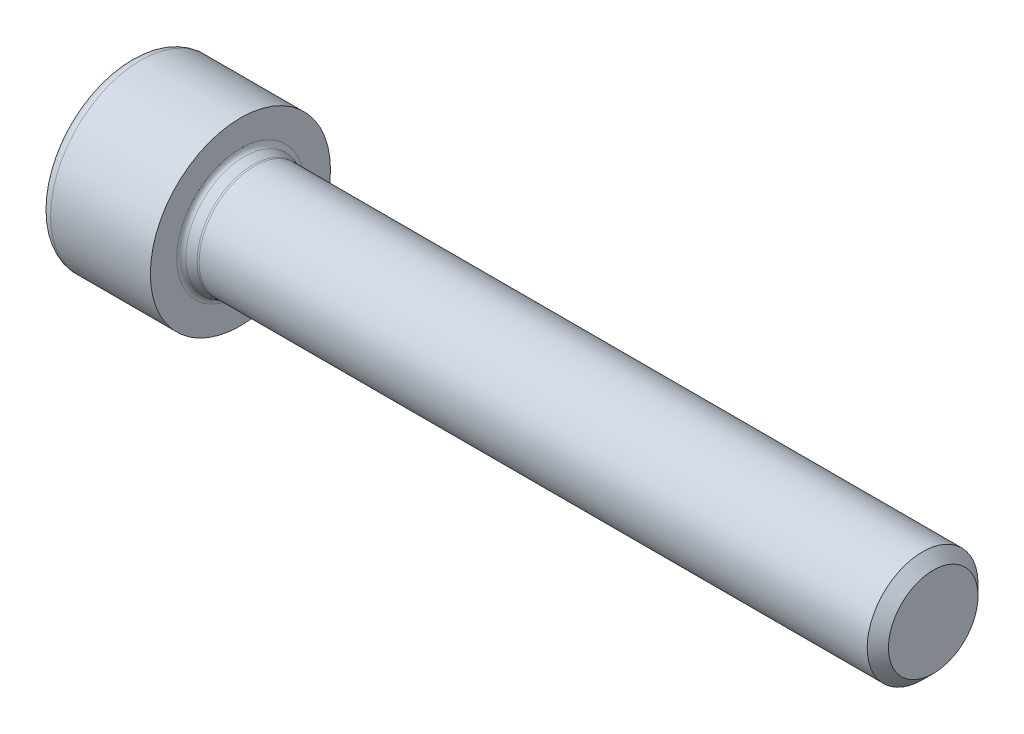
ISO-10303-21;
HEADER;
FILE_DESCRIPTION(('STEP AP214'),'2;1');
FILE_NAME('part.step','',(''),(''),'','','');
FILE_SCHEMA(('AUTOMOTIVE_DESIGN { 1 0 10303 214 1 1 1 1 }'));
ENDSEC;
DATA;
#1=APPLICATION_CONTEXT('core data for automotive mechanical design processes');
#2=APPLICATION_PROTOCOL_DEFINITION('international standard','automotive_design',2000,#1);
#3=PRODUCT_CONTEXT('',#1,'mechanical');
#4=PRODUCT('Part','Part','',(#3));
#5=PRODUCT_RELATED_PRODUCT_CATEGORY('part','',(#4));
#6=PRODUCT_DEFINITION_FORMATION('','',#4);
#7=PRODUCT_DEFINITION_CONTEXT('part definition',#1,'design');
#8=PRODUCT_DEFINITION('design','',#6,#7);
#9=PRODUCT_DEFINITION_SHAPE('','',#8);
#10=(LENGTH_UNIT() NAMED_UNIT(*) SI_UNIT(.MILLI.,.METRE.));
#11=(NAMED_UNIT(*) PLANE_ANGLE_UNIT() SI_UNIT($,.RADIAN.));
#12=(NAMED_UNIT(*) SI_UNIT($,.STERADIAN.) SOLID_ANGLE_UNIT());
#13=UNCERTAINTY_MEASURE_WITH_UNIT(LENGTH_MEASURE(1.E-05),#10,'distance_accuracy_value','');
#14=(GEOMETRIC_REPRESENTATION_CONTEXT(3) GLOBAL_UNCERTAINTY_ASSIGNED_CONTEXT((#13)) GLOBAL_UNIT_ASSIGNED_CONTEXT((#10,
#11,#12)) REPRESENTATION_CONTEXT('',''));
#15=CARTESIAN_POINT('',(0.,0.,0.));
#16=DIRECTION('',(0.,0.,1.));
#17=DIRECTION('',(1.,0.,0.));
#18=AXIS2_PLACEMENT_3D('',#15,#16,#17);
#19=CARTESIAN_POINT('',(-3.3,0.,0.));
#20=DIRECTION('',(1.,0.,0.));
#21=DIRECTION('',(0.,0.,-1.));
#22=AXIS2_PLACEMENT_3D('',#19,#20,#21);
#23=PLANE('',#22);
#24=DIRECTION('',(0.,-0.500000000000001,-0.866025403784438));
#25=VECTOR('',#24,1.);
#26=CARTESIAN_POINT('',(-3.3,-1.73205080756888,3.));
#27=LINE('',#26,#25);
#28=CARTESIAN_POINT('',(-3.3,-1.73205080756888,3.));
#29=VERTEX_POINT('',#28);
#30=CARTESIAN_POINT('',(-3.30000000000453,-2.59807621137183,1.50000000001069));
#31=VERTEX_POINT('',#30);
#32=EDGE_CURVE('E109',#29,#31,#27,.T.);
#33=ORIENTED_EDGE('',*,*,#32,.F.);
#34=DIRECTION('',(0.,1.,0.));
#35=VECTOR('',#34,1.);
#36=CARTESIAN_POINT('',(-3.3,0.,3.));
#37=LINE('',#36,#35);
#38=CARTESIAN_POINT('',(-3.29999999998218,0.,2.99999999998943));
#39=VERTEX_POINT('',#38);
#40=EDGE_CURVE('E93',#39,#29,#37,.F.);
#41=ORIENTED_EDGE('',*,*,#40,.F.);
#42=CARTESIAN_POINT('',(-3.30000000000905,0.,0.));
#43=DIRECTION('',(-1.,0.,0.));
#44=DIRECTION('',(0.,0.,1.));
#45=AXIS2_PLACEMENT_3D('',#42,#43,#44);
#46=CIRCLE('',#45,3.00000000004275);
#47=EDGE_CURVE('E18',#39,#31,#46,.F.);
#48=ORIENTED_EDGE('',*,*,#47,.T.);
#49=EDGE_LOOP('',(#33,#41,#48));
#50=FACE_BOUND('',#49,.T.);
#51=ADVANCED_FACE('F15',(#50),#23,.F.);
#52=CARTESIAN_POINT('',(-3.3,0.,0.));
#53=DIRECTION('',(1.,0.,0.));
#54=DIRECTION('',(0.,0.,-1.));
#55=AXIS2_PLACEMENT_3D('',#52,#53,#54);
#56=PLANE('',#55);
#57=DIRECTION('',(0.,0.499999999999996,-0.866025403784441));
#58=VECTOR('',#57,1.);
#59=CARTESIAN_POINT('',(-3.3,-3.46410161513775,0.));
#60=LINE('',#59,#58);
#61=CARTESIAN_POINT('',(-3.3,-3.46410161513775,0.));
#62=VERTEX_POINT('',#61);
#63=CARTESIAN_POINT('',(-3.30000000000453,-2.59807621137183,-1.50000000001069));
#64=VERTEX_POINT('',#63);
#65=EDGE_CURVE('E421',#62,#64,#60,.T.);
#66=ORIENTED_EDGE('',*,*,#65,.F.);
#67=DIRECTION('',(0.,-0.499999999999996,-0.866025403784441));
#68=VECTOR('',#67,1.);
#69=CARTESIAN_POINT('',(-3.3,-2.59807621135332,1.5));
#70=LINE('',#69,#68);
#71=EDGE_CURVE('E425',#31,#62,#70,.T.);
#72=ORIENTED_EDGE('',*,*,#71,.F.);
#73=CARTESIAN_POINT('',(-3.30000000000905,0.,0.));
#74=DIRECTION('',(-1.,0.,0.));
#75=DIRECTION('',(0.,0.,1.));
#76=AXIS2_PLACEMENT_3D('',#73,#74,#75);
#77=CIRCLE('',#76,3.00000000004275);
#78=EDGE_CURVE('E126',#31,#64,#77,.F.);
#79=ORIENTED_EDGE('',*,*,#78,.T.);
#80=EDGE_LOOP('',(#66,#72,#79));
#81=FACE_BOUND('',#80,.T.);
#82=ADVANCED_FACE('F506',(#81),#56,.F.);
#83=CARTESIAN_POINT('',(-3.3,0.,0.));
#84=DIRECTION('',(1.,0.,0.));
#85=DIRECTION('',(0.,0.,-1.));
#86=AXIS2_PLACEMENT_3D('',#83,#84,#85);
#87=PLANE('',#86);
#88=DIRECTION('',(0.,1.,0.));
#89=VECTOR('',#88,1.);
#90=CARTESIAN_POINT('',(-3.3,0.,-3.));
#91=LINE('',#90,#89);
#92=CARTESIAN_POINT('',(-3.3,-1.73205080756888,-3.));
#93=VERTEX_POINT('',#92);
#94=CARTESIAN_POINT('',(-3.29999999998218,0.,-2.99999999998943));
#95=VERTEX_POINT('',#94);
#96=EDGE_CURVE('E412',#93,#95,#91,.T.);
#97=ORIENTED_EDGE('',*,*,#96,.F.);
#98=DIRECTION('',(0.,0.500000000000001,-0.866025403784438));
#99=VECTOR('',#98,1.);
#100=CARTESIAN_POINT('',(-3.3,-2.59807621135332,-1.5));
#101=LINE('',#100,#99);
#102=EDGE_CURVE('E416',#64,#93,#101,.T.);
#103=ORIENTED_EDGE('',*,*,#102,.F.);
#104=CARTESIAN_POINT('',(-3.30000000000905,0.,0.));
#105=DIRECTION('',(-1.,0.,0.));
#106=DIRECTION('',(0.,0.,1.));
#107=AXIS2_PLACEMENT_3D('',#104,#105,#106);
#108=CIRCLE('',#107,3.00000000004275);
#109=EDGE_CURVE('E127',#64,#95,#108,.F.);
#110=ORIENTED_EDGE('',*,*,#109,.T.);
#111=EDGE_LOOP('',(#97,#103,#110));
#112=FACE_BOUND('',#111,.T.);
#113=ADVANCED_FACE('F508',(#112),#87,.F.);
#114=CARTESIAN_POINT('',(-3.3,0.,0.));
#115=DIRECTION('',(1.,0.,0.));
#116=DIRECTION('',(0.,0.,-1.));
#117=AXIS2_PLACEMENT_3D('',#114,#115,#116);
#118=PLANE('',#117);
#119=DIRECTION('',(0.,-0.499999999999996,0.866025403784441));
#120=VECTOR('',#119,1.);
#121=CARTESIAN_POINT('',(-3.3,3.46410161513775,0.));
#122=LINE('',#121,#120);
#123=CARTESIAN_POINT('',(-3.3,3.46410161513775,0.));
#124=VERTEX_POINT('',#123);
#125=CARTESIAN_POINT('',(-3.30000000000453,2.59807621137183,1.50000000001069));
#126=VERTEX_POINT('',#125);
#127=EDGE_CURVE('E403',#124,#126,#122,.T.);
#128=ORIENTED_EDGE('',*,*,#127,.F.);
#129=DIRECTION('',(0.,0.499999999999996,0.866025403784441));
#130=VECTOR('',#129,1.);
#131=CARTESIAN_POINT('',(-3.3,2.59807621135332,-1.5));
#132=LINE('',#131,#130);
#133=CARTESIAN_POINT('',(-3.30000000000453,2.59807621137183,-1.50000000001069));
#134=VERTEX_POINT('',#133);
#135=EDGE_CURVE('E407',#134,#124,#132,.T.);
#136=ORIENTED_EDGE('',*,*,#135,.F.);
#137=CARTESIAN_POINT('',(-3.30000000000905,0.,0.));
#138=DIRECTION('',(-1.,0.,0.));
#139=DIRECTION('',(0.,0.,1.));
#140=AXIS2_PLACEMENT_3D('',#137,#138,#139);
#141=CIRCLE('',#140,3.00000000004275);
#142=EDGE_CURVE('E118',#134,#126,#141,.F.);
#143=ORIENTED_EDGE('',*,*,#142,.T.);
#144=EDGE_LOOP('',(#128,#136,#143));
#145=FACE_BOUND('',#144,.T.);
#146=ADVANCED_FACE('F513',(#145),#118,.F.);
#147=CARTESIAN_POINT('',(-3.3,0.,0.));
#148=DIRECTION('',(1.,0.,0.));
#149=DIRECTION('',(0.,0.,-1.));
#150=AXIS2_PLACEMENT_3D('',#147,#148,#149);
#151=PLANE('',#150);
#152=DIRECTION('',(0.,1.,0.));
#153=VECTOR('',#152,1.);
#154=CARTESIAN_POINT('',(-3.3,0.,3.));
#155=LINE('',#154,#153);
#156=CARTESIAN_POINT('',(-3.3,1.73205080756888,3.));
#157=VERTEX_POINT('',#156);
#158=EDGE_CURVE('E87',#157,#39,#155,.F.);
#159=ORIENTED_EDGE('',*,*,#158,.F.);
#160=DIRECTION('',(0.,-0.500000000000001,0.866025403784438));
#161=VECTOR('',#160,1.);
#162=CARTESIAN_POINT('',(-3.3,2.59807621135332,1.5));
#163=LINE('',#162,#161);
#164=EDGE_CURVE('E101',#126,#157,#163,.T.);
#165=ORIENTED_EDGE('',*,*,#164,.F.);
#166=CARTESIAN_POINT('',(-3.30000000000905,0.,0.));
#167=DIRECTION('',(-1.,0.,0.));
#168=DIRECTION('',(0.,0.,1.));
#169=AXIS2_PLACEMENT_3D('',#166,#167,#168);
#170=CIRCLE('',#169,3.00000000004275);
#171=EDGE_CURVE('E112',#126,#39,#170,.F.);
#172=ORIENTED_EDGE('',*,*,#171,.T.);
#173=EDGE_LOOP('',(#159,#165,#172));
#174=FACE_BOUND('',#173,.T.);
#175=ADVANCED_FACE('F113',(#174),#151,.F.);
#176=CARTESIAN_POINT('',(-3.2999999999106,0.,0.));
#177=DIRECTION('',(-1.,0.,0.));
#178=DIRECTION('',(0.,0.,1.));
#179=AXIS2_PLACEMENT_3D('',#176,#177,#178);
#180=CONICAL_SURFACE('',#179,2.99999999987222,1.04719755110239);
#181=CARTESIAN_POINT('',(-3.30000000000905,0.,0.));
#182=DIRECTION('',(-1.,0.,0.));
#183=DIRECTION('',(0.,0.,1.));
#184=AXIS2_PLACEMENT_3D('',#181,#182,#183);
#185=CIRCLE('',#184,3.00000000004275);
#186=EDGE_CURVE('E117',#134,#95,#185,.T.);
#187=ORIENTED_EDGE('',*,*,#186,.T.);
#188=ORIENTED_EDGE('',*,*,#109,.F.);
#189=ORIENTED_EDGE('',*,*,#78,.F.);
#190=ORIENTED_EDGE('',*,*,#47,.F.);
#191=ORIENTED_EDGE('',*,*,#171,.F.);
#192=ORIENTED_EDGE('',*,*,#142,.F.);
#193=EDGE_LOOP('',(#187,#188,#189,#190,#191,#192));
#194=FACE_BOUND('',#193,.T.);
#195=CARTESIAN_POINT('',(-1.56794919232084,0.,-2.55795384873636E-10));
#196=VERTEX_POINT('',#195);
#197=VERTEX_LOOP('',#196);
#198=FACE_BOUND('',#197,.T.);
#199=ADVANCED_FACE('F122',(#194,#198),#180,.F.);
#200=CARTESIAN_POINT('',(-3.3,0.,0.));
#201=DIRECTION('',(1.,0.,0.));
#202=DIRECTION('',(0.,0.,-1.));
#203=AXIS2_PLACEMENT_3D('',#200,#201,#202);
#204=PLANE('',#203);
#205=DIRECTION('',(0.,0.5,0.866025403784439));
#206=VECTOR('',#205,1.);
#207=CARTESIAN_POINT('',(-3.3,1.73205080756888,-3.));
#208=LINE('',#207,#206);
#209=CARTESIAN_POINT('',(-3.3,1.73205080756888,-3.));
#210=VERTEX_POINT('',#209);
#211=EDGE_CURVE('E357',#134,#210,#208,.F.);
#212=ORIENTED_EDGE('',*,*,#211,.T.);
#213=DIRECTION('',(0.,1.,0.));
#214=VECTOR('',#213,1.);
#215=CARTESIAN_POINT('',(-3.3,-1.73205080756888,-3.));
#216=LINE('',#215,#214);
#217=EDGE_CURVE('E363',#210,#95,#216,.F.);
#218=ORIENTED_EDGE('',*,*,#217,.T.);
#219=ORIENTED_EDGE('',*,*,#186,.F.);
#220=EDGE_LOOP('',(#212,#218,#219));
#221=FACE_BOUND('',#220,.T.);
#222=ADVANCED_FACE('F229',(#221),#204,.F.);
#223=CARTESIAN_POINT('',(-3.3,-1.73205080756888,-3.));
#224=DIRECTION('',(0.,0.,-1.));
#225=DIRECTION('',(-1.,0.,0.));
#226=AXIS2_PLACEMENT_3D('',#223,#224,#225);
#227=PLANE('',#226);
#228=DIRECTION('',(1.,0.,0.));
#229=VECTOR('',#228,1.);
#230=CARTESIAN_POINT('',(-3.3,-1.73205080756887,-3.));
#231=LINE('',#230,#229);
#232=CARTESIAN_POINT('',(-8.,-1.73205080756888,-3.));
#233=VERTEX_POINT('',#232);
#234=EDGE_CURVE('E316',#233,#93,#231,.T.);
#235=ORIENTED_EDGE('',*,*,#234,.T.);
#236=ORIENTED_EDGE('',*,*,#96,.T.);
#237=ORIENTED_EDGE('',*,*,#217,.F.);
#238=DIRECTION('',(1.,0.,0.));
#239=VECTOR('',#238,1.);
#240=CARTESIAN_POINT('',(-3.3,1.73205080756888,-3.));
#241=LINE('',#240,#239);
#242=CARTESIAN_POINT('',(-8.,1.73205080756888,-3.));
#243=VERTEX_POINT('',#242);
#244=EDGE_CURVE('E351',#210,#243,#241,.F.);
#245=ORIENTED_EDGE('',*,*,#244,.T.);
#246=DIRECTION('',(0.,1.,0.));
#247=VECTOR('',#246,1.);
#248=CARTESIAN_POINT('',(-8.,-1.73205080756888,-3.));
#249=LINE('',#248,#247);
#250=CARTESIAN_POINT('',(-8.0000000000191,1.66279884535793,-3.));
#251=VERTEX_POINT('',#250);
#252=EDGE_CURVE('E137',#251,#243,#249,.T.);
#253=ORIENTED_EDGE('',*,*,#252,.F.);
#254=CARTESIAN_POINT('',(-8.0000000000072,1.66279884533339,-3.));
#255=CARTESIAN_POINT('',(-7.94457951590259,1.54839786950279,-3.));
#256=CARTESIAN_POINT('',(-7.89255504949964,1.4321346012482,-3.));
#257=CARTESIAN_POINT('',(-7.79749081596233,1.19524089234107,-3.));
#258=CARTESIAN_POINT('',(-7.75450475547621,1.07458908192495,-3.));
#259=CARTESIAN_POINT('',(-7.68055917664624,0.830097361921202,-3.));
#260=CARTESIAN_POINT('',(-7.64955152429931,0.706272390077356,-3.));
#261=CARTESIAN_POINT('',(-7.60200648808349,0.456113870426356,-3.));
#262=CARTESIAN_POINT('',(-7.58542823330765,0.329788451414381,-3.));
#263=CARTESIAN_POINT('',(-7.57457701784483,0.169211525008978,-3.));
#264=CARTESIAN_POINT('',(-7.57286251024816,0.135385818434172,-3.));
#265=CARTESIAN_POINT('',(-7.57057376998554,0.0677081805860357,-3.));
#266=CARTESIAN_POINT('',(-7.56999909353267,0.0338562646547737,-3.));
#267=CARTESIAN_POINT('',(-7.57000243795345,-0.091056633576471,-3.));
#268=CARTESIAN_POINT('',(-7.57416832249271,-0.182144723399112,-3.));
#269=CARTESIAN_POINT('',(-7.59060245009468,-0.363623434436348,-3.));
#270=CARTESIAN_POINT('',(-7.60287645431267,-0.454013513450057,-3.));
#271=CARTESIAN_POINT('',(-7.63494354623352,-0.633832496232013,-3.));
#272=CARTESIAN_POINT('',(-7.65476849809207,-0.723255652041912,-3.));
#273=CARTESIAN_POINT('',(-7.70103445810118,-0.900384207706354,-3.));
#274=CARTESIAN_POINT('',(-7.72747778193268,-0.988088994720558,-3.));
#275=CARTESIAN_POINT('',(-7.79078563591767,-1.17580296731579,-3.));
#276=CARTESIAN_POINT('',(-7.82864799657331,-1.27547142710709,-3.));
#277=CARTESIAN_POINT('',(-7.91025063875088,-1.47142944335597,-3.));
#278=CARTESIAN_POINT('',(-7.95394024471417,-1.56773998651197,-3.));
#279=CARTESIAN_POINT('',(-8.00000000000744,-1.66279884533387,-3.));
#280=B_SPLINE_CURVE_WITH_KNOTS('',3,(#254,#255,#256,#257,#258,#259,#260,#261,#262,#263,#264,
#265,#266,#267,#268,#269,#270,#271,#272,#273,#274,#275,#276,#277,#278,#279),.UNSPECIFIED.,.F.,
.F.,(4,2,2,2,2,2,2,2,2,2,2,2,4),(0.,0.381596151879224,0.7653994036385,1.14764392753234,
1.52880219668148,1.63039670046213,1.73195164121827,2.00508428365845,2.27841120721509,
2.55290455325676,2.8274940754861,3.14711192905309,3.46411232256088),.UNSPECIFIED.);
#281=CARTESIAN_POINT('',(-8.0000000000191,-1.66279884535793,-3.));
#282=VERTEX_POINT('',#281);
#283=EDGE_CURVE('E138',#251,#282,#280,.T.);
#284=ORIENTED_EDGE('',*,*,#283,.T.);
#285=DIRECTION('',(0.,1.,0.));
#286=VECTOR('',#285,1.);
#287=CARTESIAN_POINT('',(-8.,-1.73205080756888,-3.));
#288=LINE('',#287,#286);
#289=EDGE_CURVE('E358',#233,#282,#288,.T.);
#290=ORIENTED_EDGE('',*,*,#289,.F.);
#291=EDGE_LOOP('',(#235,#236,#237,#245,#253,#284,#290));
#292=FACE_BOUND('',#291,.T.);
#293=ADVANCED_FACE('F153',(#292),#227,.F.);
#294=CARTESIAN_POINT('',(-3.3,1.73205080756888,-3.));
#295=DIRECTION('',(0.,0.866025403784439,-0.5));
#296=DIRECTION('',(0.,0.5,0.866025403784439));
#297=AXIS2_PLACEMENT_3D('',#294,#295,#296);
#298=PLANE('',#297);
#299=ORIENTED_EDGE('',*,*,#244,.F.);
#300=ORIENTED_EDGE('',*,*,#211,.F.);
#301=ORIENTED_EDGE('',*,*,#135,.T.);
#302=DIRECTION('',(1.,0.,0.));
#303=VECTOR('',#302,1.);
#304=CARTESIAN_POINT('',(-3.3,3.46410161513775,0.));
#305=LINE('',#304,#303);
#306=CARTESIAN_POINT('',(-8.,3.46410161513775,0.));
#307=VERTEX_POINT('',#306);
#308=EDGE_CURVE('E341',#124,#307,#305,.F.);
#309=ORIENTED_EDGE('',*,*,#308,.T.);
#310=DIRECTION('',(0.,0.5,0.866025403784439));
#311=VECTOR('',#310,1.);
#312=CARTESIAN_POINT('',(-8.,1.73205080756888,-3.));
#313=LINE('',#312,#311);
#314=CARTESIAN_POINT('',(-8.0000000000191,3.42947563403228,-0.0599739585366039));
#315=VERTEX_POINT('',#314);
#316=EDGE_CURVE('E354',#315,#307,#313,.T.);
#317=ORIENTED_EDGE('',*,*,#316,.F.);
#318=CARTESIAN_POINT('',(-8.00000000000721,3.42947563402001,-0.0599739585578532));
#319=CARTESIAN_POINT('',(-7.94457951590259,3.37227514610471,-0.159048109844882));
#320=CARTESIAN_POINT('',(-7.89255504949965,3.31414351197742,-0.259735053680366));
#321=CARTESIAN_POINT('',(-7.79749081596233,3.19569665752385,-0.464891023590654));
#322=CARTESIAN_POINT('',(-7.75450475547621,3.13537075231579,-0.569378556423596));
#323=CARTESIAN_POINT('',(-7.68055917664625,3.01312489231392,-0.781114596961792));
#324=CARTESIAN_POINT('',(-7.64955152429931,2.951212406392,-0.888350168201456));
#325=CARTESIAN_POINT('',(-7.60200648808349,2.8261331465665,-1.10499380119233));
#326=CARTESIAN_POINT('',(-7.58542823330765,2.76297043706051,-1.21439482320042));
#327=CARTESIAN_POINT('',(-7.57457701784483,2.68268197385781,-1.35345852072912));
#328=CARTESIAN_POINT('',(-7.57286251024817,2.6657691205704,-1.38275244192386));
#329=CARTESIAN_POINT('',(-7.57057376998554,2.63193030164634,-1.44136299556847));
#330=CARTESIAN_POINT('',(-7.56999909353268,2.61500434368071,-1.47067961473172));
#331=CARTESIAN_POINT('',(-7.57000243795345,2.55254789456508,-1.57885735786031));
#332=CARTESIAN_POINT('',(-7.57416832249271,2.50700384965376,-1.65774195762892));
#333=CARTESIAN_POINT('',(-7.59060245009468,2.41626449413515,-1.81490713163322));
#334=CARTESIAN_POINT('',(-7.60287645431267,2.37106945462829,-1.89318723630918));
#335=CARTESIAN_POINT('',(-7.63494354623352,2.28115996323731,-2.04891504348103));
#336=CARTESIAN_POINT('',(-7.65476849809207,2.23644838533236,-2.12635776809897));
#337=CARTESIAN_POINT('',(-7.70103445810118,2.14788410750014,-2.27975559704003));
#338=CARTESIAN_POINT('',(-7.72747778193268,2.10403171399304,-2.35571017062783));
#339=CARTESIAN_POINT('',(-7.79078563591765,2.01017472769547,-2.51827523954052));
#340=CARTESIAN_POINT('',(-7.82864799657325,1.96034049779986,-2.60459065767578));
#341=CARTESIAN_POINT('',(-7.91025063875074,1.86236148967549,-2.77429527782239));
#342=CARTESIAN_POINT('',(-7.95394024471398,1.81420621809754,-2.85770265484769));
#343=CARTESIAN_POINT('',(-8.0000000000072,1.76667678868662,-2.94002604144215));
#344=B_SPLINE_CURVE_WITH_KNOTS('',3,(#318,#319,#320,#321,#322,#323,#324,#325,#326,#327,#328,
#329,#330,#331,#332,#333,#334,#335,#336,#337,#338,#339,#340,#341,#342,#343),.UNSPECIFIED.,.F.,
.F.,(4,2,2,2,2,2,2,2,2,2,2,2,4),(0.,0.381596151879223,0.765399403638495,1.14764392753234,
1.52880219668148,1.63039670046213,1.73195164121827,2.00508428365844,2.27841120721509,
2.55290455325676,2.82749407548609,3.14711192905282,3.46411232256035),.UNSPECIFIED.);
#345=CARTESIAN_POINT('',(-8.0000000000191,1.76667678867436,-2.9400260414634));
#346=VERTEX_POINT('',#345);
#347=EDGE_CURVE('E145',#315,#346,#344,.T.);
#348=ORIENTED_EDGE('',*,*,#347,.T.);
#349=DIRECTION('',(0.,0.5,0.866025403784439));
#350=VECTOR('',#349,1.);
#351=CARTESIAN_POINT('',(-8.,1.73205080756888,-3.));
#352=LINE('',#351,#350);
#353=EDGE_CURVE('E347',#243,#346,#352,.T.);
#354=ORIENTED_EDGE('',*,*,#353,.F.);
#355=EDGE_LOOP('',(#299,#300,#301,#309,#317,#348,#354));
#356=FACE_BOUND('',#355,.T.);
#357=ADVANCED_FACE('F220',(#356),#298,.F.);
#358=CARTESIAN_POINT('',(-3.3,3.46410161513775,0.));
#359=DIRECTION('',(0.,0.866025403784439,0.5));
#360=DIRECTION('',(0.,-0.5,0.866025403784439));
#361=AXIS2_PLACEMENT_3D('',#358,#359,#360);
#362=PLANE('',#361);
#363=ORIENTED_EDGE('',*,*,#308,.F.);
#364=ORIENTED_EDGE('',*,*,#127,.T.);
#365=ORIENTED_EDGE('',*,*,#164,.T.);
#366=DIRECTION('',(1.,0.,0.));
#367=VECTOR('',#366,1.);
#368=CARTESIAN_POINT('',(-3.3,1.73205080756888,3.));
#369=LINE('',#368,#367);
#370=CARTESIAN_POINT('',(-8.,1.73205080756888,3.));
#371=VERTEX_POINT('',#370);
#372=EDGE_CURVE('E97',#157,#371,#369,.F.);
#373=ORIENTED_EDGE('',*,*,#372,.T.);
#374=DIRECTION('',(0.,-0.5,0.866025403784439));
#375=VECTOR('',#374,1.);
#376=CARTESIAN_POINT('',(-8.,3.46410161513775,0.));
#377=LINE('',#376,#375);
#378=CARTESIAN_POINT('',(-8.0000000000191,1.76667678867435,2.9400260414634));
#379=VERTEX_POINT('',#378);
#380=EDGE_CURVE('E344',#379,#371,#377,.T.);
#381=ORIENTED_EDGE('',*,*,#380,.F.);
#382=CARTESIAN_POINT('',(-8.0000000000072,1.76667678868662,2.94002604144215));
#383=CARTESIAN_POINT('',(-7.94457951590259,1.82387727660192,2.84095189015512));
#384=CARTESIAN_POINT('',(-7.89255504949964,1.88200891072922,2.74026494631963));
#385=CARTESIAN_POINT('',(-7.79749081596232,2.00045576518278,2.53510897640934));
#386=CARTESIAN_POINT('',(-7.75450475547621,2.06078167039084,2.4306214435764));
#387=CARTESIAN_POINT('',(-7.68055917664624,2.18302753039271,2.21888540303821));
#388=CARTESIAN_POINT('',(-7.6495515242993,2.24494001631463,2.11164983179854));
#389=CARTESIAN_POINT('',(-7.60200648808348,2.37001927614013,1.89500619880767));
#390=CARTESIAN_POINT('',(-7.58542823330764,2.43318198564612,1.78560517679958));
#391=CARTESIAN_POINT('',(-7.57457701784483,2.51347044884882,1.64654147927088));
#392=CARTESIAN_POINT('',(-7.57286251024816,2.53038330213623,1.61724755807614));
#393=CARTESIAN_POINT('',(-7.57057376998553,2.5642221210603,1.55863700443153));
#394=CARTESIAN_POINT('',(-7.56999909353267,2.58114807902593,1.52932038526828));
#395=CARTESIAN_POINT('',(-7.57000243795345,2.64360452814155,1.42114264213968));
#396=CARTESIAN_POINT('',(-7.5741683224927,2.68914857305287,1.34225804237108));
#397=CARTESIAN_POINT('',(-7.59060245009468,2.77988792857149,1.18509286836677));
#398=CARTESIAN_POINT('',(-7.60287645431266,2.82508296807834,1.10681276369082));
#399=CARTESIAN_POINT('',(-7.63494354623352,2.91499245946932,0.95108495651897));
#400=CARTESIAN_POINT('',(-7.65476849809207,2.95970403737427,0.873642231901022));
#401=CARTESIAN_POINT('',(-7.70103445810117,3.04826831520649,0.720244402959971));
#402=CARTESIAN_POINT('',(-7.72747778193268,3.09212070871359,0.644289829372167));
#403=CARTESIAN_POINT('',(-7.79078563591764,3.18597769501116,0.481724760459474));
#404=CARTESIAN_POINT('',(-7.82864799657324,3.23581192490677,0.395409342324213));
#405=CARTESIAN_POINT('',(-7.91025063875073,3.33379093303114,0.225704722177608));
#406=CARTESIAN_POINT('',(-7.95394024471398,3.3819462046091,0.142297345152309));
#407=CARTESIAN_POINT('',(-8.0000000000072,3.42947563402001,0.0599739585578491));
#408=B_SPLINE_CURVE_WITH_KNOTS('',3,(#382,#383,#384,#385,#386,#387,#388,#389,#390,#391,#392,
#393,#394,#395,#396,#397,#398,#399,#400,#401,#402,#403,#404,#405,#406,#407),.UNSPECIFIED.,.F.,
.F.,(4,2,2,2,2,2,2,2,2,2,2,2,4),(0.,0.381596151879224,0.765399403638498,1.14764392753234,
1.52880219668148,1.63039670046213,1.73195164121828,2.00508428365845,2.27841120721509,
2.55290455325676,2.8274940754861,3.14711192905283,3.46411232256035),.UNSPECIFIED.);
#409=CARTESIAN_POINT('',(-8.0000000000191,3.42947563403228,0.059973958536592));
#410=VERTEX_POINT('',#409);
#411=EDGE_CURVE('E210',#379,#410,#408,.T.);
#412=ORIENTED_EDGE('',*,*,#411,.T.);
#413=DIRECTION('',(0.,-0.5,0.866025403784439));
#414=VECTOR('',#413,1.);
#415=CARTESIAN_POINT('',(-8.,3.46410161513775,0.));
#416=LINE('',#415,#414);
#417=EDGE_CURVE('E337',#307,#410,#416,.T.);
#418=ORIENTED_EDGE('',*,*,#417,.F.);
#419=EDGE_LOOP('',(#363,#364,#365,#373,#381,#412,#418));
#420=FACE_BOUND('',#419,.T.);
#421=ADVANCED_FACE('F217',(#420),#362,.F.);
#422=CARTESIAN_POINT('',(-3.3,1.73205080756888,3.));
#423=DIRECTION('',(0.,0.,1.));
#424=DIRECTION('',(1.,0.,0.));
#425=AXIS2_PLACEMENT_3D('',#422,#423,#424);
#426=PLANE('',#425);
#427=DIRECTION('',(0.,1.,0.));
#428=VECTOR('',#427,1.);
#429=CARTESIAN_POINT('',(-8.,1.73205080756888,3.));
#430=LINE('',#429,#428);
#431=CARTESIAN_POINT('',(-8.0000000000191,1.66279884535793,3.));
#432=VERTEX_POINT('',#431);
#433=EDGE_CURVE('E328',#371,#432,#430,.F.);
#434=ORIENTED_EDGE('',*,*,#433,.F.);
#435=ORIENTED_EDGE('',*,*,#372,.F.);
#436=ORIENTED_EDGE('',*,*,#158,.T.);
#437=ORIENTED_EDGE('',*,*,#40,.T.);
#438=DIRECTION('',(1.,0.,0.));
#439=VECTOR('',#438,1.);
#440=CARTESIAN_POINT('',(-3.3,-1.73205080756888,3.));
#441=LINE('',#440,#439);
#442=CARTESIAN_POINT('',(-8.,-1.73205080756888,3.));
#443=VERTEX_POINT('',#442);
#444=EDGE_CURVE('E322',#29,#443,#441,.F.);
#445=ORIENTED_EDGE('',*,*,#444,.T.);
#446=DIRECTION('',(0.,1.,0.));
#447=VECTOR('',#446,1.);
#448=CARTESIAN_POINT('',(-8.,1.73205080756888,3.));
#449=LINE('',#448,#447);
#450=CARTESIAN_POINT('',(-8.0000000000191,-1.66279884535793,3.));
#451=VERTEX_POINT('',#450);
#452=EDGE_CURVE('E334',#451,#443,#449,.F.);
#453=ORIENTED_EDGE('',*,*,#452,.F.);
#454=CARTESIAN_POINT('',(-8.00000000000744,-1.66279884533387,3.));
#455=CARTESIAN_POINT('',(-7.9445795159028,-1.54839786950324,3.));
#456=CARTESIAN_POINT('',(-7.89255504949982,-1.43213460124862,3.));
#457=CARTESIAN_POINT('',(-7.79749081596246,-1.19524089234144,3.));
#458=CARTESIAN_POINT('',(-7.75450475547632,-1.07458908192529,3.));
#459=CARTESIAN_POINT('',(-7.68055917664632,-0.830097361921482,3.));
#460=CARTESIAN_POINT('',(-7.64955152429936,-0.706272390077604,3.));
#461=CARTESIAN_POINT('',(-7.60200648808351,-0.456113870426538,3.));
#462=CARTESIAN_POINT('',(-7.58542823330766,-0.329788451414529,3.));
#463=CARTESIAN_POINT('',(-7.57457701784484,-0.169211525009072,3.));
#464=CARTESIAN_POINT('',(-7.57286251024817,-0.135385818434248,3.));
#465=CARTESIAN_POINT('',(-7.57057376998554,-0.0677081805860735,3.));
#466=CARTESIAN_POINT('',(-7.56999909353267,-0.0338562646547927,3.));
#467=CARTESIAN_POINT('',(-7.57000243795345,0.0910566335764707,3.));
#468=CARTESIAN_POINT('',(-7.57416832249271,0.182144723399112,3.));
#469=CARTESIAN_POINT('',(-7.59060245009468,0.363623434436348,3.));
#470=CARTESIAN_POINT('',(-7.60287645431267,0.454013513450057,3.));
#471=CARTESIAN_POINT('',(-7.63494354623352,0.633832496232012,3.));
#472=CARTESIAN_POINT('',(-7.65476849809207,0.723255652041912,3.));
#473=CARTESIAN_POINT('',(-7.70103445810118,0.900384207706353,3.));
#474=CARTESIAN_POINT('',(-7.72747778193268,0.988088994720557,3.));
#475=CARTESIAN_POINT('',(-7.79078563591767,1.17580296731579,3.));
#476=CARTESIAN_POINT('',(-7.82864799657331,1.27547142710709,3.));
#477=CARTESIAN_POINT('',(-7.91025063875088,1.47142944335597,3.));
#478=CARTESIAN_POINT('',(-7.95394024471417,1.56773998651197,3.));
#479=CARTESIAN_POINT('',(-8.00000000000744,1.66279884533387,3.));
#480=B_SPLINE_CURVE_WITH_KNOTS('',3,(#454,#455,#456,#457,#458,#459,#460,#461,#462,#463,#464,
#465,#466,#467,#468,#469,#470,#471,#472,#473,#474,#475,#476,#477,#478,#479),.UNSPECIFIED.,.F.,
.F.,(4,2,2,2,2,2,2,2,2,2,2,2,4),(0.,0.381596151879327,0.765399403638704,1.14764392753265,
1.52880219668189,1.63039670046261,1.7319516412188,2.00508428365898,2.27841120721562,
2.55290455325729,2.82749407548663,3.14711192905362,3.46411232256141),.UNSPECIFIED.);
#481=EDGE_CURVE('E205',#451,#432,#480,.T.);
#482=ORIENTED_EDGE('',*,*,#481,.T.);
#483=EDGE_LOOP('',(#434,#435,#436,#437,#445,#453,#482));
#484=FACE_BOUND('',#483,.T.);
#485=ADVANCED_FACE('F90',(#484),#426,.F.);
#486=CARTESIAN_POINT('',(-3.3,-1.73205080756888,3.));
#487=DIRECTION('',(0.,-0.866025403784439,0.5));
#488=DIRECTION('',(0.,-0.5,-0.866025403784439));
#489=AXIS2_PLACEMENT_3D('',#486,#487,#488);
#490=PLANE('',#489);
#491=ORIENTED_EDGE('',*,*,#444,.F.);
#492=ORIENTED_EDGE('',*,*,#32,.T.);
#493=ORIENTED_EDGE('',*,*,#71,.T.);
#494=DIRECTION('',(1.,0.,0.));
#495=VECTOR('',#494,1.);
#496=CARTESIAN_POINT('',(-3.3,-3.46410161513775,0.));
#497=LINE('',#496,#495);
#498=CARTESIAN_POINT('',(-8.,-3.46410161513775,0.));
#499=VERTEX_POINT('',#498);
#500=EDGE_CURVE('E310',#62,#499,#497,.F.);
#501=ORIENTED_EDGE('',*,*,#500,.T.);
#502=DIRECTION('',(0.,-0.5,-0.866025403784439));
#503=VECTOR('',#502,1.);
#504=CARTESIAN_POINT('',(-8.,-1.73205080756888,3.));
#505=LINE('',#504,#503);
#506=CARTESIAN_POINT('',(-8.0000000000191,-3.42947563403228,0.0599739585366039));
#507=VERTEX_POINT('',#506);
#508=EDGE_CURVE('E325',#507,#499,#505,.T.);
#509=ORIENTED_EDGE('',*,*,#508,.F.);
#510=CARTESIAN_POINT('',(-8.00000000000721,-3.42947563402001,0.0599739585578531));
#511=CARTESIAN_POINT('',(-7.94457951590259,-3.37227514610471,0.159048109844882));
#512=CARTESIAN_POINT('',(-7.89255504949965,-3.31414351197742,0.259735053680366));
#513=CARTESIAN_POINT('',(-7.79749081596233,-3.19569665752385,0.464891023590655));
#514=CARTESIAN_POINT('',(-7.75450475547621,-3.13537075231579,0.569378556423597));
#515=CARTESIAN_POINT('',(-7.68055917664625,-3.01312489231392,0.781114596961793));
#516=CARTESIAN_POINT('',(-7.64955152429931,-2.951212406392,0.888350168201457));
#517=CARTESIAN_POINT('',(-7.60200648808349,-2.8261331465665,1.10499380119233));
#518=CARTESIAN_POINT('',(-7.58542823330765,-2.76297043706051,1.21439482320042));
#519=CARTESIAN_POINT('',(-7.57457701784483,-2.68268197385781,1.35345852072912));
#520=CARTESIAN_POINT('',(-7.57286251024817,-2.6657691205704,1.38275244192386));
#521=CARTESIAN_POINT('',(-7.57057376998554,-2.63193030164634,1.44136299556847));
#522=CARTESIAN_POINT('',(-7.56999909353268,-2.61500434368071,1.47067961473172));
#523=CARTESIAN_POINT('',(-7.57000243795345,-2.55254789456508,1.57885735786031));
#524=CARTESIAN_POINT('',(-7.57416832249271,-2.50700384965376,1.65774195762892));
#525=CARTESIAN_POINT('',(-7.59060245009468,-2.41626449413515,1.81490713163322));
#526=CARTESIAN_POINT('',(-7.60287645431267,-2.37106945462829,1.89318723630918));
#527=CARTESIAN_POINT('',(-7.63494354623353,-2.28115996323731,2.04891504348103));
#528=CARTESIAN_POINT('',(-7.65476849809207,-2.23644838533236,2.12635776809897));
#529=CARTESIAN_POINT('',(-7.70103445810118,-2.14788410750014,2.27975559704003));
#530=CARTESIAN_POINT('',(-7.72747778193268,-2.10403171399304,2.35571017062783));
#531=CARTESIAN_POINT('',(-7.79078563591768,-2.01017472769543,2.5182752395406));
#532=CARTESIAN_POINT('',(-7.82864799657331,-1.96034049779978,2.60459065767593));
#533=CARTESIAN_POINT('',(-7.91025063875088,-1.86236148967533,2.77429527782267));
#534=CARTESIAN_POINT('',(-7.95394024471417,-1.81420621809734,2.85770265484803));
#535=CARTESIAN_POINT('',(-8.00000000000744,-1.76667678868639,2.94002604144256));
#536=B_SPLINE_CURVE_WITH_KNOTS('',3,(#510,#511,#512,#513,#514,#515,#516,#517,#518,#519,#520,
#521,#522,#523,#524,#525,#526,#527,#528,#529,#530,#531,#532,#533,#534,#535),.UNSPECIFIED.,.F.,
.F.,(4,2,2,2,2,2,2,2,2,2,2,2,4),(0.,0.381596151879223,0.765399403638496,1.14764392753234,
1.52880219668148,1.63039670046213,1.73195164121827,2.00508428365845,2.27841120721509,
2.55290455325676,2.82749407548609,3.14711192905309,3.46411232256087),.UNSPECIFIED.);
#537=CARTESIAN_POINT('',(-8.0000000000191,-1.76667678867436,2.9400260414634));
#538=VERTEX_POINT('',#537);
#539=EDGE_CURVE('E179',#507,#538,#536,.T.);
#540=ORIENTED_EDGE('',*,*,#539,.T.);
#541=DIRECTION('',(0.,-0.5,-0.866025403784439));
#542=VECTOR('',#541,1.);
#543=CARTESIAN_POINT('',(-8.,-1.73205080756888,3.));
#544=LINE('',#543,#542);
#545=EDGE_CURVE('E317',#443,#538,#544,.T.);
#546=ORIENTED_EDGE('',*,*,#545,.F.);
#547=EDGE_LOOP('',(#491,#492,#493,#501,#509,#540,#546));
#548=FACE_BOUND('',#547,.T.);
#549=ADVANCED_FACE('F168',(#548),#490,.F.);
#550=CARTESIAN_POINT('',(-3.3,-3.46410161513775,0.));
#551=DIRECTION('',(0.,-0.866025403784439,-0.5));
#552=DIRECTION('',(0.,0.5,-0.866025403784439));
#553=AXIS2_PLACEMENT_3D('',#550,#551,#552);
#554=PLANE('',#553);
#555=ORIENTED_EDGE('',*,*,#500,.F.);
#556=ORIENTED_EDGE('',*,*,#65,.T.);
#557=ORIENTED_EDGE('',*,*,#102,.T.);
#558=ORIENTED_EDGE('',*,*,#234,.F.);
#559=DIRECTION('',(0.,0.5,-0.866025403784439));
#560=VECTOR('',#559,1.);
#561=CARTESIAN_POINT('',(-8.,-3.46410161513775,0.));
#562=LINE('',#561,#560);
#563=CARTESIAN_POINT('',(-8.0000000000191,-1.76667678867435,-2.9400260414634));
#564=VERTEX_POINT('',#563);
#565=EDGE_CURVE('E313',#564,#233,#562,.T.);
#566=ORIENTED_EDGE('',*,*,#565,.F.);
#567=CARTESIAN_POINT('',(-8.0000000000072,-1.76667678868662,-2.94002604144215));
#568=CARTESIAN_POINT('',(-7.94457951590259,-1.82387727660192,-2.84095189015512));
#569=CARTESIAN_POINT('',(-7.89255504949964,-1.88200891072922,-2.74026494631963));
#570=CARTESIAN_POINT('',(-7.79749081596232,-2.00045576518278,-2.53510897640934));
#571=CARTESIAN_POINT('',(-7.75450475547621,-2.06078167039084,-2.4306214435764));
#572=CARTESIAN_POINT('',(-7.68055917664624,-2.18302753039271,-2.21888540303821));
#573=CARTESIAN_POINT('',(-7.6495515242993,-2.24494001631463,-2.11164983179854));
#574=CARTESIAN_POINT('',(-7.60200648808348,-2.37001927614013,-1.89500619880767));
#575=CARTESIAN_POINT('',(-7.58542823330764,-2.43318198564612,-1.78560517679958));
#576=CARTESIAN_POINT('',(-7.57457701784483,-2.51347044884882,-1.64654147927088));
#577=CARTESIAN_POINT('',(-7.57286251024816,-2.53038330213623,-1.61724755807614));
#578=CARTESIAN_POINT('',(-7.57057376998553,-2.5642221210603,-1.55863700443153));
#579=CARTESIAN_POINT('',(-7.56999909353267,-2.58114807902593,-1.52932038526828));
#580=CARTESIAN_POINT('',(-7.57000243795345,-2.64360452814155,-1.42114264213968));
#581=CARTESIAN_POINT('',(-7.5741683224927,-2.68914857305287,-1.34225804237108));
#582=CARTESIAN_POINT('',(-7.59060245009468,-2.77988792857149,-1.18509286836678));
#583=CARTESIAN_POINT('',(-7.60287645431266,-2.82508296807834,-1.10681276369082));
#584=CARTESIAN_POINT('',(-7.63494354623352,-2.91499245946932,-0.951084956518971));
#585=CARTESIAN_POINT('',(-7.65476849809207,-2.95970403737427,-0.873642231901023));
#586=CARTESIAN_POINT('',(-7.70103445810117,-3.04826831520649,-0.720244402959971));
#587=CARTESIAN_POINT('',(-7.72747778193268,-3.09212070871359,-0.644289829372167));
#588=CARTESIAN_POINT('',(-7.79078563591767,-3.18597769501121,-0.481724760459401));
#589=CARTESIAN_POINT('',(-7.82864799657331,-3.23581192490686,-0.395409342324068));
#590=CARTESIAN_POINT('',(-7.91025063875087,-3.3337909330313,-0.225704722177327));
#591=CARTESIAN_POINT('',(-7.95394024471417,-3.3819462046093,-0.142297345151962));
#592=CARTESIAN_POINT('',(-8.00000000000743,-3.42947563402025,-0.0599739585574376));
#593=B_SPLINE_CURVE_WITH_KNOTS('',3,(#567,#568,#569,#570,#571,#572,#573,#574,#575,#576,#577,
#578,#579,#580,#581,#582,#583,#584,#585,#586,#587,#588,#589,#590,#591,#592),.UNSPECIFIED.,.F.,
.F.,(4,2,2,2,2,2,2,2,2,2,2,2,4),(0.,0.381596151879223,0.765399403638496,1.14764392753234,
1.52880219668147,1.63039670046213,1.73195164121828,2.00508428365845,2.27841120721509,
2.55290455325676,2.8274940754861,3.1471119290531,3.46411232256088),.UNSPECIFIED.);
#594=CARTESIAN_POINT('',(-8.0000000000191,-3.42947563403228,-0.059973958536592));
#595=VERTEX_POINT('',#594);
#596=EDGE_CURVE('E33',#564,#595,#593,.T.);
#597=ORIENTED_EDGE('',*,*,#596,.T.);
#598=DIRECTION('',(0.,0.5,-0.866025403784439));
#599=VECTOR('',#598,1.);
#600=CARTESIAN_POINT('',(-8.,-3.46410161513775,0.));
#601=LINE('',#600,#599);
#602=EDGE_CURVE('E146',#499,#595,#601,.T.);
#603=ORIENTED_EDGE('',*,*,#602,.F.);
#604=EDGE_LOOP('',(#555,#556,#557,#558,#566,#597,#603));
#605=FACE_BOUND('',#604,.T.);
#606=ADVANCED_FACE('F161',(#605),#554,.F.);
#607=CARTESIAN_POINT('',(-8.0000000000382,0.,0.));
#608=DIRECTION('',(-1.,0.,0.));
#609=DIRECTION('',(0.,0.,1.));
#610=AXIS2_PLACEMENT_3D('',#607,#608,#609);
#611=CONICAL_SURFACE('',#610,3.43000000003713,0.785398163397448);
#612=CARTESIAN_POINT('',(-8.0000000000382,0.,0.));
#613=DIRECTION('',(-1.,0.,0.));
#614=DIRECTION('',(0.,0.,1.));
#615=AXIS2_PLACEMENT_3D('',#612,#613,#614);
#616=CIRCLE('',#615,3.43000000003713);
#617=EDGE_CURVE('E178',#282,#251,#616,.F.);
#618=ORIENTED_EDGE('',*,*,#617,.F.);
#619=ORIENTED_EDGE('',*,*,#283,.F.);
#620=EDGE_LOOP('',(#618,#619));
#621=FACE_BOUND('',#620,.T.);
#622=ADVANCED_FACE('F156',(#621),#611,.F.);
#623=CARTESIAN_POINT('',(-8.0000000000382,0.,0.));
#624=DIRECTION('',(-1.,0.,0.));
#625=DIRECTION('',(0.,0.,1.));
#626=AXIS2_PLACEMENT_3D('',#623,#624,#625);
#627=CONICAL_SURFACE('',#626,3.43000000003713,0.785398163397448);
#628=ORIENTED_EDGE('',*,*,#347,.F.);
#629=CARTESIAN_POINT('',(-8.0000000000382,0.,0.));
#630=DIRECTION('',(-1.,0.,0.));
#631=DIRECTION('',(0.,0.,1.));
#632=AXIS2_PLACEMENT_3D('',#629,#630,#631);
#633=CIRCLE('',#632,3.43000000003713);
#634=EDGE_CURVE('E454',#346,#315,#633,.F.);
#635=ORIENTED_EDGE('',*,*,#634,.F.);
#636=EDGE_LOOP('',(#628,#635));
#637=FACE_BOUND('',#636,.T.);
#638=ADVANCED_FACE('F160',(#637),#627,.F.);
#639=CARTESIAN_POINT('',(-8.0000000000382,0.,0.));
#640=DIRECTION('',(-1.,0.,0.));
#641=DIRECTION('',(0.,0.,1.));
#642=AXIS2_PLACEMENT_3D('',#639,#640,#641);
#643=CONICAL_SURFACE('',#642,3.43000000003713,0.785398163397448);
#644=ORIENTED_EDGE('',*,*,#411,.F.);
#645=CARTESIAN_POINT('',(-8.0000000000382,0.,0.));
#646=DIRECTION('',(-1.,0.,0.));
#647=DIRECTION('',(0.,0.,1.));
#648=AXIS2_PLACEMENT_3D('',#645,#646,#647);
#649=CIRCLE('',#648,3.43000000003713);
#650=EDGE_CURVE('E452',#410,#379,#649,.F.);
#651=ORIENTED_EDGE('',*,*,#650,.F.);
#652=EDGE_LOOP('',(#644,#651));
#653=FACE_BOUND('',#652,.T.);
#654=ADVANCED_FACE('F202',(#653),#643,.F.);
#655=CARTESIAN_POINT('',(-8.0000000000382,0.,0.));
#656=DIRECTION('',(-1.,0.,0.));
#657=DIRECTION('',(0.,0.,1.));
#658=AXIS2_PLACEMENT_3D('',#655,#656,#657);
#659=CONICAL_SURFACE('',#658,3.43000000003713,0.785398163397448);
#660=ORIENTED_EDGE('',*,*,#481,.F.);
#661=CARTESIAN_POINT('',(-8.0000000000382,0.,0.));
#662=DIRECTION('',(-1.,0.,0.));
#663=DIRECTION('',(0.,0.,1.));
#664=AXIS2_PLACEMENT_3D('',#661,#662,#663);
#665=CIRCLE('',#664,3.43000000003713);
#666=EDGE_CURVE('E449',#432,#451,#665,.F.);
#667=ORIENTED_EDGE('',*,*,#666,.F.);
#668=EDGE_LOOP('',(#660,#667));
#669=FACE_BOUND('',#668,.T.);
#670=ADVANCED_FACE('F198',(#669),#659,.F.);
#671=CARTESIAN_POINT('',(-8.0000000000382,0.,0.));
#672=DIRECTION('',(-1.,0.,0.));
#673=DIRECTION('',(0.,0.,1.));
#674=AXIS2_PLACEMENT_3D('',#671,#672,#673);
#675=CONICAL_SURFACE('',#674,3.43000000003713,0.785398163397448);
#676=CARTESIAN_POINT('',(-8.0000000000382,0.,0.));
#677=DIRECTION('',(-1.,0.,0.));
#678=DIRECTION('',(0.,0.,1.));
#679=AXIS2_PLACEMENT_3D('',#676,#677,#678);
#680=CIRCLE('',#679,3.43000000003713);
#681=EDGE_CURVE('E446',#538,#507,#680,.F.);
#682=ORIENTED_EDGE('',*,*,#681,.F.);
#683=ORIENTED_EDGE('',*,*,#539,.F.);
#684=EDGE_LOOP('',(#682,#683));
#685=FACE_BOUND('',#684,.T.);
#686=ADVANCED_FACE('F191',(#685),#675,.F.);
#687=CARTESIAN_POINT('',(-8.0000000000382,0.,0.));
#688=DIRECTION('',(-1.,0.,0.));
#689=DIRECTION('',(0.,0.,1.));
#690=AXIS2_PLACEMENT_3D('',#687,#688,#689);
#691=CONICAL_SURFACE('',#690,3.43000000003713,0.785398163397448);
#692=CARTESIAN_POINT('',(-8.0000000000382,0.,0.));
#693=DIRECTION('',(-1.,0.,0.));
#694=DIRECTION('',(0.,0.,1.));
#695=AXIS2_PLACEMENT_3D('',#692,#693,#694);
#696=CIRCLE('',#695,3.43000000003713);
#697=EDGE_CURVE('E442',#595,#564,#696,.F.);
#698=ORIENTED_EDGE('',*,*,#697,.F.);
#699=ORIENTED_EDGE('',*,*,#596,.F.);
#700=EDGE_LOOP('',(#698,#699));
#701=FACE_BOUND('',#700,.T.);
#702=ADVANCED_FACE('F186',(#701),#691,.F.);
#703=CARTESIAN_POINT('',(-8.,0.,-4.565));
#704=DIRECTION('',(-1.,0.,0.));
#705=DIRECTION('',(0.,0.,1.));
#706=AXIS2_PLACEMENT_3D('',#703,#704,#705);
#707=PLANE('',#706);
#708=ORIENTED_EDGE('',*,*,#602,.T.);
#709=ORIENTED_EDGE('',*,*,#697,.T.);
#710=ORIENTED_EDGE('',*,*,#565,.T.);
#711=ORIENTED_EDGE('',*,*,#289,.T.);
#712=ORIENTED_EDGE('',*,*,#617,.T.);
#713=ORIENTED_EDGE('',*,*,#252,.T.);
#714=ORIENTED_EDGE('',*,*,#353,.T.);
#715=ORIENTED_EDGE('',*,*,#634,.T.);
#716=ORIENTED_EDGE('',*,*,#316,.T.);
#717=ORIENTED_EDGE('',*,*,#417,.T.);
#718=ORIENTED_EDGE('',*,*,#650,.T.);
#719=ORIENTED_EDGE('',*,*,#380,.T.);
#720=ORIENTED_EDGE('',*,*,#433,.T.);
#721=ORIENTED_EDGE('',*,*,#666,.T.);
#722=ORIENTED_EDGE('',*,*,#452,.T.);
#723=ORIENTED_EDGE('',*,*,#545,.T.);
#724=ORIENTED_EDGE('',*,*,#681,.T.);
#725=ORIENTED_EDGE('',*,*,#508,.T.);
#726=EDGE_LOOP('',(#708,#709,#710,#711,#712,#713,#714,#715,#716,#717,#718,#719,#720,#721,#722,
#723,#724,#725));
#727=FACE_BOUND('',#726,.T.);
#728=CARTESIAN_POINT('',(-8.,0.,0.));
#729=DIRECTION('',(1.,0.,0.));
#730=DIRECTION('',(0.,0.,-1.));
#731=AXIS2_PLACEMENT_3D('',#728,#729,#730);
#732=CIRCLE('',#731,5.7);
#733=CARTESIAN_POINT('',(-8.,0.,-5.7));
#734=VERTEX_POINT('',#733);
#735=EDGE_CURVE('E445',#734,#734,#732,.T.);
#736=ORIENTED_EDGE('',*,*,#735,.F.);
#737=EDGE_LOOP('',(#736));
#738=FACE_BOUND('',#737,.T.);
#739=ADVANCED_FACE('F190',(#727,#738),#707,.T.);
#740=CARTESIAN_POINT('',(-7.20000000000001,0.,0.));
#741=DIRECTION('',(-1.,0.,0.));
#742=DIRECTION('',(0.,0.,1.));
#743=AXIS2_PLACEMENT_3D('',#740,#741,#742);
#744=TOROIDAL_SURFACE('',#743,5.70000000000001,0.799999999999994);
#745=CARTESIAN_POINT('',(-7.2,0.,0.));
#746=DIRECTION('',(-1.,0.,0.));
#747=DIRECTION('',(0.,0.,1.));
#748=AXIS2_PLACEMENT_3D('',#745,#746,#747);
#749=CIRCLE('',#748,6.5);
#750=CARTESIAN_POINT('',(-7.2,0.,6.5));
#751=VERTEX_POINT('',#750);
#752=EDGE_CURVE('E290',#751,#751,#749,.F.);
#753=ORIENTED_EDGE('',*,*,#752,.F.);
#754=EDGE_LOOP('',(#753));
#755=FACE_BOUND('',#754,.T.);
#756=ORIENTED_EDGE('',*,*,#735,.T.);
#757=EDGE_LOOP('',(#756));
#758=FACE_BOUND('',#757,.T.);
#759=ADVANCED_FACE('F292',(#755,#758),#744,.T.);
#760=CARTESIAN_POINT('',(-3.6,0.,0.));
#761=DIRECTION('',(-1.,0.,0.));
#762=DIRECTION('',(0.,0.,1.));
#763=AXIS2_PLACEMENT_3D('',#760,#761,#762);
#764=CYLINDRICAL_SURFACE('',#763,6.5);
#765=CARTESIAN_POINT('',(0.,0.,0.));
#766=DIRECTION('',(-1.,0.,0.));
#767=DIRECTION('',(0.,0.,1.));
#768=AXIS2_PLACEMENT_3D('',#765,#766,#767);
#769=CIRCLE('',#768,6.5);
#770=CARTESIAN_POINT('',(0.,0.,6.5));
#771=VERTEX_POINT('',#770);
#772=EDGE_CURVE('E439',#771,#771,#769,.F.);
#773=ORIENTED_EDGE('',*,*,#772,.F.);
#774=EDGE_LOOP('',(#773));
#775=FACE_BOUND('',#774,.T.);
#776=ORIENTED_EDGE('',*,*,#752,.T.);
#777=EDGE_LOOP('',(#776));
#778=FACE_BOUND('',#777,.T.);
#779=ADVANCED_FACE('F295',(#775,#778),#764,.T.);
#780=CARTESIAN_POINT('',(0.,0.,-5.55));
#781=DIRECTION('',(1.,0.,0.));
#782=DIRECTION('',(0.,0.,-1.));
#783=AXIS2_PLACEMENT_3D('',#780,#781,#782);
#784=PLANE('',#783);
#785=CARTESIAN_POINT('',(0.,0.,0.));
#786=DIRECTION('',(1.,0.,0.));
#787=DIRECTION('',(0.,0.,1.));
#788=AXIS2_PLACEMENT_3D('',#785,#786,#787);
#789=CIRCLE('',#788,4.6);
#790=CARTESIAN_POINT('',(0.,0.,4.6));
#791=VERTEX_POINT('',#790);
#792=EDGE_CURVE('E261',#791,#791,#789,.F.);
#793=ORIENTED_EDGE('',*,*,#792,.T.);
#794=EDGE_LOOP('',(#793));
#795=FACE_BOUND('',#794,.T.);
#796=ORIENTED_EDGE('',*,*,#772,.T.);
#797=EDGE_LOOP('',(#796));
#798=FACE_BOUND('',#797,.T.);
#799=ADVANCED_FACE('F273',(#795,#798),#784,.T.);
#800=CARTESIAN_POINT('',(0.4,0.,0.));
#801=DIRECTION('',(-1.,0.,0.));
#802=DIRECTION('',(0.,0.,1.));
#803=AXIS2_PLACEMENT_3D('',#800,#801,#802);
#804=TOROIDAL_SURFACE('',#803,4.6,0.4);
#805=CARTESIAN_POINT('',(0.27719888799993,0.,0.));
#806=DIRECTION('',(-1.,0.,0.));
#807=DIRECTION('',(0.,0.,-1.));
#808=AXIS2_PLACEMENT_3D('',#805,#806,#807);
#809=CIRCLE('',#808,4.21931655293406);
#810=CARTESIAN_POINT('',(0.27719888799993,0.,-4.21931655293406));
#811=VERTEX_POINT('',#810);
#812=EDGE_CURVE('E259',#811,#811,#809,.F.);
#813=ORIENTED_EDGE('',*,*,#812,.F.);
#814=EDGE_LOOP('',(#813));
#815=FACE_BOUND('',#814,.T.);
#816=ORIENTED_EDGE('',*,*,#792,.F.);
#817=EDGE_LOOP('',(#816));
#818=FACE_BOUND('',#817,.T.);
#819=ADVANCED_FACE('F268',(#815,#818),#804,.F.);
#820=CARTESIAN_POINT('',(0.277198888113617,0.,0.));
#821=DIRECTION('',(-1.,0.,0.));
#822=DIRECTION('',(0.,0.,1.));
#823=AXIS2_PLACEMENT_3D('',#820,#821,#822);
#824=CONICAL_SURFACE('',#823,4.21931655287722,0.312042121559855);
#825=ORIENTED_EDGE('',*,*,#812,.T.);
#826=EDGE_LOOP('',(#825));
#827=FACE_BOUND('',#826,.T.);
#828=CARTESIAN_POINT('',(0.897198888030895,0.,0.));
#829=DIRECTION('',(-1.,0.,0.));
#830=DIRECTION('',(0.,0.,1.));
#831=AXIS2_PLACEMENT_3D('',#828,#829,#830);
#832=CIRCLE('',#831,4.01931655289578);
#833=CARTESIAN_POINT('',(0.897198888030895,0.,4.01931655289578));
#834=VERTEX_POINT('',#833);
#835=EDGE_CURVE('E255',#834,#834,#832,.T.);
#836=ORIENTED_EDGE('',*,*,#835,.T.);
#837=EDGE_LOOP('',(#836));
#838=FACE_BOUND('',#837,.T.);
#839=ADVANCED_FACE('F272',(#827,#838),#824,.T.);
#840=CARTESIAN_POINT('',(50.,0.,-1.6165));
#841=DIRECTION('',(1.,0.,0.));
#842=DIRECTION('',(0.,0.,-1.));
#843=AXIS2_PLACEMENT_3D('',#840,#841,#842);
#844=PLANE('',#843);
#845=CARTESIAN_POINT('',(50.0000000000114,0.,0.));
#846=DIRECTION('',(-1.,0.,0.));
#847=DIRECTION('',(0.,-1.,0.));
#848=AXIS2_PLACEMENT_3D('',#845,#846,#847);
#849=CIRCLE('',#848,3.23300000002291);
#850=CARTESIAN_POINT('',(50.0000000000114,-3.23300000002291,0.));
#851=VERTEX_POINT('',#850);
#852=EDGE_CURVE('E258',#851,#851,#849,.T.);
#853=ORIENTED_EDGE('',*,*,#852,.F.);
#854=EDGE_LOOP('',(#853));
#855=FACE_BOUND('',#854,.T.);
#856=ADVANCED_FACE('F249',(#855),#844,.T.);
#857=CARTESIAN_POINT('',(1.01999999999999,0.,0.));
#858=DIRECTION('',(-1.,0.,0.));
#859=DIRECTION('',(0.,0.,1.));
#860=AXIS2_PLACEMENT_3D('',#857,#858,#859);
#861=TOROIDAL_SURFACE('',#860,4.39999999999992,0.399999999999923);
#862=CARTESIAN_POINT('',(1.02,0.,0.));
#863=DIRECTION('',(-1.,0.,0.));
#864=DIRECTION('',(0.,0.,1.));
#865=AXIS2_PLACEMENT_3D('',#862,#863,#864);
#866=CIRCLE('',#865,4.);
#867=CARTESIAN_POINT('',(1.02,0.,4.));
#868=VERTEX_POINT('',#867);
#869=EDGE_CURVE('E24',#868,#868,#866,.F.);
#870=ORIENTED_EDGE('',*,*,#869,.F.);
#871=EDGE_LOOP('',(#870));
#872=FACE_BOUND('',#871,.T.);
#873=ORIENTED_EDGE('',*,*,#835,.F.);
#874=EDGE_LOOP('',(#873));
#875=FACE_BOUND('',#874,.T.);
#876=ADVANCED_FACE('F240',(#872,#875),#861,.F.);
#877=CARTESIAN_POINT('',(49.2330000001289,0.,0.));
#878=DIRECTION('',(-1.,0.,0.));
#879=DIRECTION('',(0.,-1.,0.));
#880=AXIS2_PLACEMENT_3D('',#877,#878,#879);
#881=CONICAL_SURFACE('',#880,3.99999999996226,0.785398163434504);
#882=ORIENTED_EDGE('',*,*,#852,.T.);
#883=EDGE_LOOP('',(#882));
#884=FACE_BOUND('',#883,.T.);
#885=CARTESIAN_POINT('',(49.233,0.,0.));
#886=DIRECTION('',(-1.,0.,0.));
#887=DIRECTION('',(0.,0.,1.));
#888=AXIS2_PLACEMENT_3D('',#885,#886,#887);
#889=CIRCLE('',#888,4.);
#890=CARTESIAN_POINT('',(49.233,0.,4.));
#891=VERTEX_POINT('',#890);
#892=EDGE_CURVE('E9',#891,#891,#889,.T.);
#893=ORIENTED_EDGE('',*,*,#892,.F.);
#894=EDGE_LOOP('',(#893));
#895=FACE_BOUND('',#894,.T.);
#896=ADVANCED_FACE('F234',(#884,#895),#881,.T.);
#897=CARTESIAN_POINT('',(25.1265,0.,0.));
#898=DIRECTION('',(-1.,0.,0.));
#899=DIRECTION('',(0.,0.,1.));
#900=AXIS2_PLACEMENT_3D('',#897,#898,#899);
#901=CYLINDRICAL_SURFACE('',#900,4.);
#902=ORIENTED_EDGE('',*,*,#869,.T.);
#903=EDGE_LOOP('',(#902));
#904=FACE_BOUND('',#903,.T.);
#905=ORIENTED_EDGE('',*,*,#892,.T.);
#906=EDGE_LOOP('',(#905));
#907=FACE_BOUND('',#906,.T.);
#908=ADVANCED_FACE('F232',(#904,#907),#901,.T.);
#909=CLOSED_SHELL('',(#51,#82,#113,#146,#175,#199,#222,#293,#357,#421,#485,#549,#606,#622,#638,
#654,#670,#686,#702,#739,#759,#779,#799,#819,#839,#856,#876,#896,#908));
#910=MANIFOLD_SOLID_BREP('B1',#909);
#911=ADVANCED_BREP_SHAPE_REPRESENTATION('',(#18,#910),#14);
#912=SHAPE_DEFINITION_REPRESENTATION(#9,#911);
ENDSEC;
END-ISO-10303-21;
